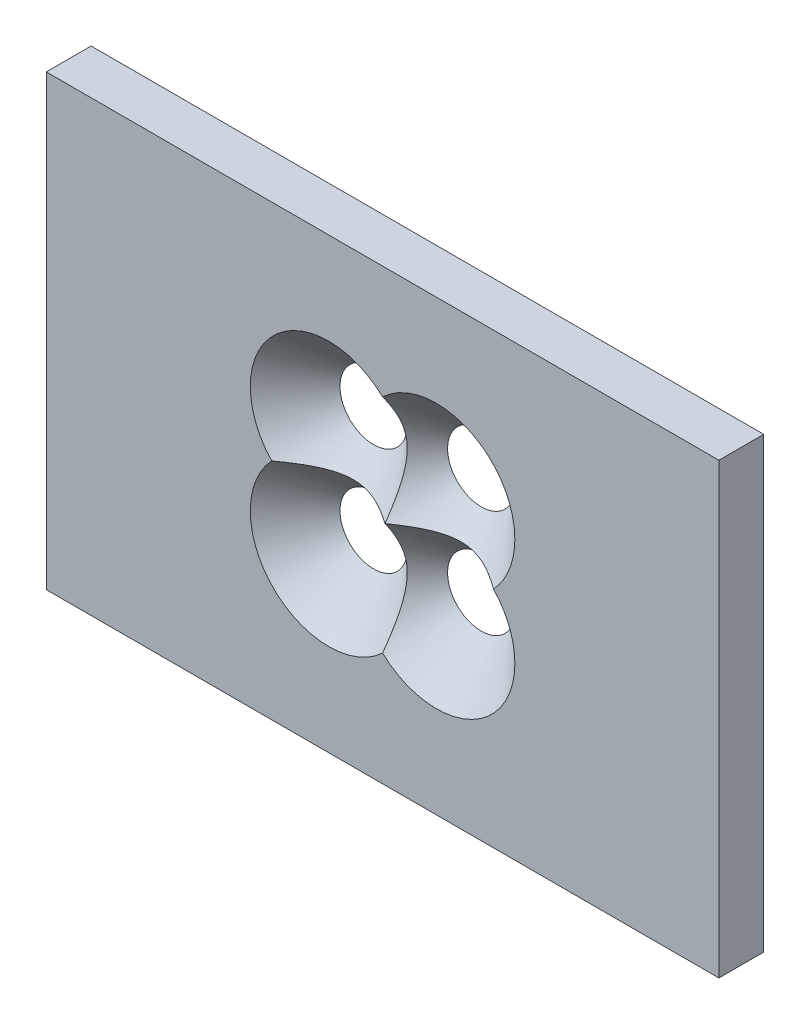
ISO-10303-21;
HEADER;
FILE_DESCRIPTION(('STEP AP214'),'2;1');
FILE_NAME('part.step','',(''),(''),'','','');
FILE_SCHEMA(('AUTOMOTIVE_DESIGN { 1 0 10303 214 1 1 1 1 }'));
ENDSEC;
DATA;
#1=APPLICATION_CONTEXT('core data for automotive mechanical design processes');
#2=APPLICATION_PROTOCOL_DEFINITION('international standard','automotive_design',2000,#1);
#3=PRODUCT_CONTEXT('',#1,'mechanical');
#4=PRODUCT('Part','Part','',(#3));
#5=PRODUCT_RELATED_PRODUCT_CATEGORY('part','',(#4));
#6=PRODUCT_DEFINITION_FORMATION('','',#4);
#7=PRODUCT_DEFINITION_CONTEXT('part definition',#1,'design');
#8=PRODUCT_DEFINITION('design','',#6,#7);
#9=PRODUCT_DEFINITION_SHAPE('','',#8);
#10=(LENGTH_UNIT() NAMED_UNIT(*) SI_UNIT(.MILLI.,.METRE.));
#11=(NAMED_UNIT(*) PLANE_ANGLE_UNIT() SI_UNIT($,.RADIAN.));
#12=(NAMED_UNIT(*) SI_UNIT($,.STERADIAN.) SOLID_ANGLE_UNIT());
#13=UNCERTAINTY_MEASURE_WITH_UNIT(LENGTH_MEASURE(1.E-05),#10,'distance_accuracy_value','');
#14=(GEOMETRIC_REPRESENTATION_CONTEXT(3) GLOBAL_UNCERTAINTY_ASSIGNED_CONTEXT((#13)) GLOBAL_UNIT_ASSIGNED_CONTEXT((#10,
#11,#12)) REPRESENTATION_CONTEXT('',''));
#15=CARTESIAN_POINT('',(0.,0.,0.));
#16=DIRECTION('',(0.,0.,1.));
#17=DIRECTION('',(1.,0.,0.));
#18=AXIS2_PLACEMENT_3D('',#15,#16,#17);
#19=CARTESIAN_POINT('',(0.,0.,100.));
#20=DIRECTION('',(0.,0.,-1.));
#21=DIRECTION('',(-1.,0.,0.));
#22=AXIS2_PLACEMENT_3D('',#19,#20,#21);
#23=PLANE('',#22);
#24=CARTESIAN_POINT('',(120.,-120.,100.));
#25=DIRECTION('',(0.,0.,-1.));
#26=DIRECTION('',(-1.,0.,0.));
#27=AXIS2_PLACEMENT_3D('',#24,#25,#26);
#28=CIRCLE('',#27,175.000000000001);
#29=CARTESIAN_POINT('',(247.377392028571,0.,100.));
#30=VERTEX_POINT('',#29);
#31=CARTESIAN_POINT('',(2.63677968348475E-13,-247.377392028571,100.));
#32=VERTEX_POINT('',#31);
#33=EDGE_CURVE('E47',#30,#32,#28,.T.);
#34=ORIENTED_EDGE('',*,*,#33,.T.);
#35=CARTESIAN_POINT('',(-120.,-120.,100.));
#36=DIRECTION('',(0.,0.,-1.));
#37=DIRECTION('',(-1.,0.,0.));
#38=AXIS2_PLACEMENT_3D('',#35,#36,#37);
#39=CIRCLE('',#38,175.000000000001);
#40=CARTESIAN_POINT('',(-247.37739202857,0.,100.));
#41=VERTEX_POINT('',#40);
#42=EDGE_CURVE('E11',#32,#41,#39,.T.);
#43=ORIENTED_EDGE('',*,*,#42,.T.);
#44=CARTESIAN_POINT('',(-120.,120.,100.));
#45=DIRECTION('',(0.,0.,-1.));
#46=DIRECTION('',(-1.,0.,0.));
#47=AXIS2_PLACEMENT_3D('',#44,#45,#46);
#48=CIRCLE('',#47,175.000000000001);
#49=CARTESIAN_POINT('',(2.35922392732846E-13,247.377392028571,100.));
#50=VERTEX_POINT('',#49);
#51=EDGE_CURVE('E113',#41,#50,#48,.T.);
#52=ORIENTED_EDGE('',*,*,#51,.T.);
#53=CARTESIAN_POINT('',(120.,120.,100.));
#54=DIRECTION('',(0.,0.,-1.));
#55=DIRECTION('',(-1.,0.,0.));
#56=AXIS2_PLACEMENT_3D('',#53,#54,#55);
#57=CIRCLE('',#56,175.000000000001);
#58=EDGE_CURVE('E115',#50,#30,#57,.T.);
#59=ORIENTED_EDGE('',*,*,#58,.T.);
#60=EDGE_LOOP('',(#34,#43,#52,#59));
#61=FACE_BOUND('',#60,.T.);
#62=DIRECTION('',(0.,1.,0.));
#63=VECTOR('',#62,1.);
#64=CARTESIAN_POINT('',(750.,-500.,100.));
#65=LINE('',#64,#63);
#66=CARTESIAN_POINT('',(750.,-500.,100.));
#67=VERTEX_POINT('',#66);
#68=CARTESIAN_POINT('',(750.,500.,100.));
#69=VERTEX_POINT('',#68);
#70=EDGE_CURVE('E100',#67,#69,#65,.T.);
#71=ORIENTED_EDGE('',*,*,#70,.T.);
#72=DIRECTION('',(-1.,0.,0.));
#73=VECTOR('',#72,1.);
#74=CARTESIAN_POINT('',(-750.,500.,100.));
#75=LINE('',#74,#73);
#76=CARTESIAN_POINT('',(-750.,500.,100.));
#77=VERTEX_POINT('',#76);
#78=EDGE_CURVE('E89',#69,#77,#75,.T.);
#79=ORIENTED_EDGE('',*,*,#78,.T.);
#80=DIRECTION('',(0.,-1.,0.));
#81=VECTOR('',#80,1.);
#82=CARTESIAN_POINT('',(-750.,-500.,100.));
#83=LINE('',#82,#81);
#84=CARTESIAN_POINT('',(-750.,-500.,100.));
#85=VERTEX_POINT('',#84);
#86=EDGE_CURVE('E99',#77,#85,#83,.T.);
#87=ORIENTED_EDGE('',*,*,#86,.T.);
#88=DIRECTION('',(1.,0.,0.));
#89=VECTOR('',#88,1.);
#90=CARTESIAN_POINT('',(-750.,-500.,100.));
#91=LINE('',#90,#89);
#92=EDGE_CURVE('E104',#85,#67,#91,.T.);
#93=ORIENTED_EDGE('',*,*,#92,.T.);
#94=EDGE_LOOP('',(#71,#79,#87,#93));
#95=FACE_BOUND('',#94,.T.);
#96=ADVANCED_FACE('F33',(#61,#95),#23,.F.);
#97=CARTESIAN_POINT('',(0.,0.,0.));
#98=DIRECTION('',(0.,0.,-1.));
#99=DIRECTION('',(-1.,0.,0.));
#100=AXIS2_PLACEMENT_3D('',#97,#98,#99);
#101=PLANE('',#100);
#102=CARTESIAN_POINT('',(120.,-120.,0.));
#103=DIRECTION('',(0.,0.,1.));
#104=DIRECTION('',(1.,0.,0.));
#105=AXIS2_PLACEMENT_3D('',#102,#103,#104);
#106=CIRCLE('',#105,75.);
#107=CARTESIAN_POINT('',(195.,-120.,0.));
#108=VERTEX_POINT('',#107);
#109=EDGE_CURVE('E260',#108,#108,#106,.T.);
#110=ORIENTED_EDGE('',*,*,#109,.T.);
#111=EDGE_LOOP('',(#110));
#112=FACE_BOUND('',#111,.T.);
#113=CARTESIAN_POINT('',(-120.,120.,0.));
#114=DIRECTION('',(0.,0.,1.));
#115=DIRECTION('',(1.,0.,0.));
#116=AXIS2_PLACEMENT_3D('',#113,#114,#115);
#117=CIRCLE('',#116,75.);
#118=CARTESIAN_POINT('',(-44.9999999999996,120.,0.));
#119=VERTEX_POINT('',#118);
#120=EDGE_CURVE('E259',#119,#119,#117,.T.);
#121=ORIENTED_EDGE('',*,*,#120,.T.);
#122=EDGE_LOOP('',(#121));
#123=FACE_BOUND('',#122,.T.);
#124=DIRECTION('',(0.,1.,0.));
#125=VECTOR('',#124,1.);
#126=CARTESIAN_POINT('',(750.,-500.,0.));
#127=LINE('',#126,#125);
#128=CARTESIAN_POINT('',(750.,-500.,0.));
#129=VERTEX_POINT('',#128);
#130=CARTESIAN_POINT('',(750.,500.,0.));
#131=VERTEX_POINT('',#130);
#132=EDGE_CURVE('E112',#129,#131,#127,.T.);
#133=ORIENTED_EDGE('',*,*,#132,.F.);
#134=DIRECTION('',(1.,0.,0.));
#135=VECTOR('',#134,1.);
#136=CARTESIAN_POINT('',(-750.,-500.,0.));
#137=LINE('',#136,#135);
#138=CARTESIAN_POINT('',(-750.,-500.,0.));
#139=VERTEX_POINT('',#138);
#140=EDGE_CURVE('E108',#139,#129,#137,.T.);
#141=ORIENTED_EDGE('',*,*,#140,.F.);
#142=DIRECTION('',(0.,-1.,0.));
#143=VECTOR('',#142,1.);
#144=CARTESIAN_POINT('',(-750.,-500.,0.));
#145=LINE('',#144,#143);
#146=CARTESIAN_POINT('',(-750.,500.,0.));
#147=VERTEX_POINT('',#146);
#148=EDGE_CURVE('E274',#147,#139,#145,.T.);
#149=ORIENTED_EDGE('',*,*,#148,.F.);
#150=DIRECTION('',(-1.,0.,0.));
#151=VECTOR('',#150,1.);
#152=CARTESIAN_POINT('',(-750.,500.,0.));
#153=LINE('',#152,#151);
#154=EDGE_CURVE('E272',#131,#147,#153,.T.);
#155=ORIENTED_EDGE('',*,*,#154,.F.);
#156=EDGE_LOOP('',(#133,#141,#149,#155));
#157=FACE_BOUND('',#156,.T.);
#158=CARTESIAN_POINT('',(120.,120.,0.));
#159=DIRECTION('',(0.,0.,1.));
#160=DIRECTION('',(1.,0.,0.));
#161=AXIS2_PLACEMENT_3D('',#158,#159,#160);
#162=CIRCLE('',#161,75.);
#163=CARTESIAN_POINT('',(195.,120.,0.));
#164=VERTEX_POINT('',#163);
#165=EDGE_CURVE('E257',#164,#164,#162,.T.);
#166=ORIENTED_EDGE('',*,*,#165,.T.);
#167=EDGE_LOOP('',(#166));
#168=FACE_BOUND('',#167,.T.);
#169=CARTESIAN_POINT('',(-120.,-120.,0.));
#170=DIRECTION('',(0.,0.,1.));
#171=DIRECTION('',(1.,0.,0.));
#172=AXIS2_PLACEMENT_3D('',#169,#170,#171);
#173=CIRCLE('',#172,75.);
#174=CARTESIAN_POINT('',(-44.9999999999996,-120.,0.));
#175=VERTEX_POINT('',#174);
#176=EDGE_CURVE('E168',#175,#175,#173,.T.);
#177=ORIENTED_EDGE('',*,*,#176,.T.);
#178=EDGE_LOOP('',(#177));
#179=FACE_BOUND('',#178,.T.);
#180=ADVANCED_FACE('F176',(#112,#123,#157,#168,#179),#101,.T.);
#181=CARTESIAN_POINT('',(750.,-500.,100.));
#182=DIRECTION('',(-1.,0.,0.));
#183=DIRECTION('',(0.,0.,1.));
#184=AXIS2_PLACEMENT_3D('',#181,#182,#183);
#185=PLANE('',#184);
#186=ORIENTED_EDGE('',*,*,#132,.T.);
#187=DIRECTION('',(0.,0.,-1.));
#188=VECTOR('',#187,1.);
#189=CARTESIAN_POINT('',(750.,500.,100.));
#190=LINE('',#189,#188);
#191=EDGE_CURVE('E93',#69,#131,#190,.T.);
#192=ORIENTED_EDGE('',*,*,#191,.F.);
#193=ORIENTED_EDGE('',*,*,#70,.F.);
#194=DIRECTION('',(0.,0.,-1.));
#195=VECTOR('',#194,1.);
#196=CARTESIAN_POINT('',(750.,-500.,100.));
#197=LINE('',#196,#195);
#198=EDGE_CURVE('E270',#67,#129,#197,.T.);
#199=ORIENTED_EDGE('',*,*,#198,.T.);
#200=EDGE_LOOP('',(#186,#192,#193,#199));
#201=FACE_BOUND('',#200,.T.);
#202=ADVANCED_FACE('F110',(#201),#185,.F.);
#203=CARTESIAN_POINT('',(-750.,500.,100.));
#204=DIRECTION('',(0.,-1.,0.));
#205=DIRECTION('',(0.,0.,-1.));
#206=AXIS2_PLACEMENT_3D('',#203,#204,#205);
#207=PLANE('',#206);
#208=ORIENTED_EDGE('',*,*,#154,.T.);
#209=DIRECTION('',(0.,0.,-1.));
#210=VECTOR('',#209,1.);
#211=CARTESIAN_POINT('',(-750.,500.,100.));
#212=LINE('',#211,#210);
#213=EDGE_CURVE('E96',#77,#147,#212,.T.);
#214=ORIENTED_EDGE('',*,*,#213,.F.);
#215=ORIENTED_EDGE('',*,*,#78,.F.);
#216=ORIENTED_EDGE('',*,*,#191,.T.);
#217=EDGE_LOOP('',(#208,#214,#215,#216));
#218=FACE_BOUND('',#217,.T.);
#219=ADVANCED_FACE('F91',(#218),#207,.F.);
#220=CARTESIAN_POINT('',(-750.,-500.,100.));
#221=DIRECTION('',(1.,0.,0.));
#222=DIRECTION('',(0.,0.,-1.));
#223=AXIS2_PLACEMENT_3D('',#220,#221,#222);
#224=PLANE('',#223);
#225=ORIENTED_EDGE('',*,*,#148,.T.);
#226=DIRECTION('',(0.,0.,-1.));
#227=VECTOR('',#226,1.);
#228=CARTESIAN_POINT('',(-750.,-500.,100.));
#229=LINE('',#228,#227);
#230=EDGE_CURVE('E117',#85,#139,#229,.T.);
#231=ORIENTED_EDGE('',*,*,#230,.F.);
#232=ORIENTED_EDGE('',*,*,#86,.F.);
#233=ORIENTED_EDGE('',*,*,#213,.T.);
#234=EDGE_LOOP('',(#225,#231,#232,#233));
#235=FACE_BOUND('',#234,.T.);
#236=ADVANCED_FACE('F187',(#235),#224,.F.);
#237=CARTESIAN_POINT('',(-750.,-500.,100.));
#238=DIRECTION('',(0.,1.,0.));
#239=DIRECTION('',(0.,0.,1.));
#240=AXIS2_PLACEMENT_3D('',#237,#238,#239);
#241=PLANE('',#240);
#242=ORIENTED_EDGE('',*,*,#140,.T.);
#243=ORIENTED_EDGE('',*,*,#198,.F.);
#244=ORIENTED_EDGE('',*,*,#92,.F.);
#245=ORIENTED_EDGE('',*,*,#230,.T.);
#246=EDGE_LOOP('',(#242,#243,#244,#245));
#247=FACE_BOUND('',#246,.T.);
#248=ADVANCED_FACE('F184',(#247),#241,.F.);
#249=CARTESIAN_POINT('',(120.,120.,-1.74860126378462E-12));
#250=DIRECTION('',(0.,0.,1.));
#251=DIRECTION('',(1.,0.,0.));
#252=AXIS2_PLACEMENT_3D('',#249,#250,#251);
#253=CONICAL_SURFACE('',#252,75.,0.785398163397443);
#254=ORIENTED_EDGE('',*,*,#165,.F.);
#255=EDGE_LOOP('',(#254));
#256=FACE_BOUND('',#255,.T.);
#257=CARTESIAN_POINT('',(247.377666802467,0.,100.0002));
#258=CARTESIAN_POINT('',(245.678079233707,0.,98.7631591177888));
#259=CARTESIAN_POINT('',(243.972975012222,0.,97.533665722493));
#260=CARTESIAN_POINT('',(240.550818607246,0.,95.0913270112612));
#261=CARTESIAN_POINT('',(238.833766100815,0.,93.8784821479578));
#262=CARTESIAN_POINT('',(235.386258471237,0.,91.4706194029449));
#263=CARTESIAN_POINT('',(233.655798663167,0.,90.2756082231325));
#264=CARTESIAN_POINT('',(230.181155356152,0.,87.9057166334808));
#265=CARTESIAN_POINT('',(228.436971942127,0.,86.7308360992191));
#266=CARTESIAN_POINT('',(224.914311341916,0.,84.3902779141285));
#267=CARTESIAN_POINT('',(223.135668647346,0.,83.2248491386579));
#268=CARTESIAN_POINT('',(219.562186512449,0.,80.9190995319762));
#269=CARTESIAN_POINT('',(217.7673471943,0.,79.7787785115887));
#270=CARTESIAN_POINT('',(214.160417112664,0.,77.5260647822753));
#271=CARTESIAN_POINT('',(212.348327811377,0.,76.4136697347602));
#272=CARTESIAN_POINT('',(208.705497504982,0.,74.2198075456046));
#273=CARTESIAN_POINT('',(206.874756466073,0.,73.1383404600245));
#274=CARTESIAN_POINT('',(203.113599518357,0.,70.9637454223439));
#275=CARTESIAN_POINT('',(201.182300987805,0.,69.8721413869572));
#276=CARTESIAN_POINT('',(197.296506765329,0.,67.7309401452992));
#277=CARTESIAN_POINT('',(195.342010976038,0.,66.681343115428));
#278=CARTESIAN_POINT('',(191.407929718509,0.,64.629063895269));
#279=CARTESIAN_POINT('',(189.428338674419,0.,63.6263923719415));
#280=CARTESIAN_POINT('',(185.443162712769,0.,61.6740287799874));
#281=CARTESIAN_POINT('',(183.437578021668,0.,60.7243362501847));
#282=CARTESIAN_POINT('',(179.408058443373,0.,58.8884422595546));
#283=CARTESIAN_POINT('',(177.384241923012,0.,58.0019816696906));
#284=CARTESIAN_POINT('',(173.308789835771,0.,56.2950998124127));
#285=CARTESIAN_POINT('',(171.257153387731,0.,55.4746806425126));
#286=CARTESIAN_POINT('',(167.126813228033,0.,53.9080575761844));
#287=CARTESIAN_POINT('',(165.048123480417,0.,53.1618169852112));
#288=CARTESIAN_POINT('',(160.863244495565,0.,51.7514293306531));
#289=CARTESIAN_POINT('',(158.75705867187,0.,51.0872721818586));
#290=CARTESIAN_POINT('',(154.647316158132,0.,49.8872025009053));
#291=CARTESIAN_POINT('',(152.645325411221,0.,49.345941685801));
#292=CARTESIAN_POINT('',(148.619875466235,0.,48.3502933248938));
#293=CARTESIAN_POINT('',(146.596417446731,0.,47.8959010357184));
#294=CARTESIAN_POINT('',(142.530285060669,0.,47.0804914989858));
#295=CARTESIAN_POINT('',(140.487607065834,0.,46.7194922638175));
#296=CARTESIAN_POINT('',(136.387086136158,0.,46.0967818998838));
#297=CARTESIAN_POINT('',(134.329243140303,0.,45.8350711708033));
#298=CARTESIAN_POINT('',(130.236774535903,0.,45.4189196455923));
#299=CARTESIAN_POINT('',(128.202321247488,0.,45.2627908866856));
#300=CARTESIAN_POINT('',(124.128107502655,0.,45.0537492705719));
#301=CARTESIAN_POINT('',(122.088347096232,0.,45.0008354445566));
#302=CARTESIAN_POINT('',(118.008837589929,0.,44.9991842322347));
#303=CARTESIAN_POINT('',(115.969088491121,0.,45.0504441533571));
#304=CARTESIAN_POINT('',(111.894822647311,0.,45.256202972461));
#305=CARTESIAN_POINT('',(109.86030592187,0.,45.4107022558428));
#306=CARTESIAN_POINT('',(105.809341635487,0.,45.819407788567));
#307=CARTESIAN_POINT('',(103.792854592753,0.,46.0732247665416));
#308=CARTESIAN_POINT('',(99.7742742232323,0.,46.6763459904533));
#309=CARTESIAN_POINT('',(97.7721809295636,0.,47.0256504560133));
#310=CARTESIAN_POINT('',(93.7856831121091,0.,47.8143800450102));
#311=CARTESIAN_POINT('',(91.8012804942418,0.,48.2538147591353));
#312=CARTESIAN_POINT('',(87.8530069396337,0.,49.2165976644573));
#313=CARTESIAN_POINT('',(85.889136157865,0.,49.7399464885421));
#314=CARTESIAN_POINT('',(81.9529462879107,0.,50.8728308866616));
#315=CARTESIAN_POINT('',(79.9809820074608,0.,51.4835949993606));
#316=CARTESIAN_POINT('',(76.061078540923,0.,52.7779545847461));
#317=CARTESIAN_POINT('',(74.1131405596655,0.,53.4615536934051));
#318=CARTESIAN_POINT('',(70.2419870735508,0.,54.8946763651614));
#319=CARTESIAN_POINT('',(68.3187689002611,0.,55.6441927430022));
#320=CARTESIAN_POINT('',(64.4966319955872,0.,57.202793705585));
#321=CARTESIAN_POINT('',(62.5977137812669,0.,58.0118795554035));
#322=CARTESIAN_POINT('',(59.1617703784402,0.,59.5338691164614));
#323=CARTESIAN_POINT('',(57.6208591303576,0.,60.2380353633006));
#324=CARTESIAN_POINT('',(54.5545621844083,0.,61.6794574834304));
#325=CARTESIAN_POINT('',(53.0291768319537,0.,62.4167140909331));
#326=CARTESIAN_POINT('',(49.9932868822399,0.,63.921566729431));
#327=CARTESIAN_POINT('',(48.4827837209339,0.,64.6891656529666));
#328=CARTESIAN_POINT('',(45.4761601434631,0.,66.2520916895603));
#329=CARTESIAN_POINT('',(43.980040085779,0.,67.0474194914515));
#330=CARTESIAN_POINT('',(41.0000405441808,0.,68.6642803036741));
#331=CARTESIAN_POINT('',(39.5161753095,0.,69.4858395484799));
#332=CARTESIAN_POINT('',(36.5615660698456,0.,71.1522633755801));
#333=CARTESIAN_POINT('',(35.090822309916,0.,71.9971283919102));
#334=CARTESIAN_POINT('',(32.1619282482796,0.,73.7081508806937));
#335=CARTESIAN_POINT('',(30.703777020075,0.,74.5743067683179));
#336=CARTESIAN_POINT('',(27.7992963773939,0.,76.3262322245131));
#337=CARTESIAN_POINT('',(26.3529671133734,0.,77.2120020421766));
#338=CARTESIAN_POINT('',(22.1456641827337,0.,79.8249515752675));
#339=CARTESIAN_POINT('',(19.3996963676134,0.,81.5763338911389));
#340=CARTESIAN_POINT('',(13.9446946012817,0.,85.135744728808));
#341=CARTESIAN_POINT('',(11.2356619496815,0.,86.9437752365008));
#342=CARTESIAN_POINT('',(7.20106504041256,0.,89.6895084408082));
#343=CARTESIAN_POINT('',(5.86302797406436,0.,90.6089505825074));
#344=CARTESIAN_POINT('',(3.19474193335325,0.,92.4590809668022));
#345=CARTESIAN_POINT('',(1.86449298059174,0.,93.3897692405686));
#346=CARTESIAN_POINT('',(-0.788454066796034,0.,95.2614660728441));
#347=CARTESIAN_POINT('',(-2.11115314221584,0.,96.2024732422041));
#348=CARTESIAN_POINT('',(-4.74955524042687,0.,98.0942147220368));
#349=CARTESIAN_POINT('',(-6.06525834317395,0.,99.044948920976));
#350=CARTESIAN_POINT('',(-7.37766680246643,0.,100.0002));
#351=B_SPLINE_CURVE_WITH_KNOTS('',3,(#257,#258,#259,#260,#261,#262,#263,#264,#265,#266,#267,
#268,#269,#270,#271,#272,#273,#274,#275,#276,#277,#278,#279,#280,#281,#282,#283,#284,#285,#286,
#287,#288,#289,#290,#291,#292,#293,#294,#295,#296,#297,#298,#299,#300,#301,#302,#303,#304,#305,
#306,#307,#308,#309,#310,#311,#312,#313,#314,#315,#316,#317,#318,#319,#320,#321,#322,#323,#324,
#325,#326,#327,#328,#329,#330,#331,#332,#333,#334,#335,#336,#337,#338,#339,#340,#341,#342,#343,
#344,#345,#346,#347,#348,#349,#350),.UNSPECIFIED.,.F.,.F.,(4,2,2,2,2,2,2,2,2,2,2,2,2,2,2,2,2,2,
2,2,2,2,2,2,2,2,2,2,2,2,2,2,2,2,2,2,2,2,2,2,2,2,2,2,2,2,4),(0.,6.30633816103411,
12.6128474376992,18.9216698682924,25.230453291599,31.6096151272588,37.9887288821992,
44.367306640444,50.7458959598095,57.4007715624049,64.0556751079186,70.7120841498134,
77.3684352394091,83.9957210792219,90.6232173225094,97.2474185981264,103.870805178199,
110.09062901598,116.310113129193,122.530795879632,128.751503671104,134.870246972121,
140.988932840385,147.107460561445,153.226011123556,159.320816710294,165.415636315308,
171.511104802015,177.60661926346,183.798218591365,189.990127153068,196.181361605562,
202.372727579203,207.454874903869,212.53713504749,217.619880858196,222.702753023163,
227.790878522526,232.879098844789,237.966941555168,243.054848917104,252.824785477402,
262.595064922856,267.465484880326,272.335918340188,277.205703991681,282.075433867026),.UNSPECIFIED.);
#352=CARTESIAN_POINT('',(1.82668317608996E-13,0.,94.7056274847708));
#353=VERTEX_POINT('',#352);
#354=EDGE_CURVE('E158',#30,#353,#351,.T.);
#355=ORIENTED_EDGE('',*,*,#354,.F.);
#356=ORIENTED_EDGE('',*,*,#58,.F.);
#357=CARTESIAN_POINT('',(2.52550743007721E-13,247.377666802467,100.0002));
#358=CARTESIAN_POINT('',(2.25763773224837E-13,245.678079233706,98.7631591177888));
#359=CARTESIAN_POINT('',(2.17597576978972E-13,243.972975012222,97.5336657224931));
#360=CARTESIAN_POINT('',(2.08151446415143E-13,240.550818607246,95.0913270112612));
#361=CARTESIAN_POINT('',(2.06871698954423E-13,238.833766100815,93.8784821479579));
#362=CARTESIAN_POINT('',(1.80836565990806E-13,235.386258471236,91.470619402945));
#363=CARTESIAN_POINT('',(1.56072570070295E-13,233.655798663167,90.2756082231326));
#364=CARTESIAN_POINT('',(1.34953255413175E-13,230.181155356152,87.9057166334809));
#365=CARTESIAN_POINT('',(1.38597761027395E-13,228.436971942126,86.7308360992192));
#366=CARTESIAN_POINT('',(1.16484774452572E-13,224.914311341916,84.3902779141286));
#367=CARTESIAN_POINT('',(0.,223.135668647345,83.2248491386581));
#368=CARTESIAN_POINT('',(0.,219.562186512448,80.9190995319763));
#369=CARTESIAN_POINT('',(0.,217.7673471943,79.778778511589));
#370=CARTESIAN_POINT('',(0.,214.160417112663,77.5260647822756));
#371=CARTESIAN_POINT('',(0.,212.348327811377,76.4136697347604));
#372=CARTESIAN_POINT('',(0.,208.705497504982,74.2198075456048));
#373=CARTESIAN_POINT('',(0.,206.874756466073,73.1383404600247));
#374=CARTESIAN_POINT('',(0.,203.113599518357,70.9637454223442));
#375=CARTESIAN_POINT('',(0.,201.182300987804,69.8721413869575));
#376=CARTESIAN_POINT('',(0.,197.296506765328,67.7309401452995));
#377=CARTESIAN_POINT('',(0.,195.342010976037,66.6813431154283));
#378=CARTESIAN_POINT('',(0.,191.407929718509,64.6290638952694));
#379=CARTESIAN_POINT('',(0.,189.428338674419,63.6263923719419));
#380=CARTESIAN_POINT('',(0.,185.443162712769,61.6740287799877));
#381=CARTESIAN_POINT('',(0.,183.437578021668,60.7243362501851));
#382=CARTESIAN_POINT('',(0.,179.408058443373,58.888442259555));
#383=CARTESIAN_POINT('',(0.,177.384241923012,58.001981669691));
#384=CARTESIAN_POINT('',(0.,173.308789835771,56.2950998124131));
#385=CARTESIAN_POINT('',(0.,171.257153387731,55.4746806425131));
#386=CARTESIAN_POINT('',(0.,167.126813228032,53.9080575761849));
#387=CARTESIAN_POINT('',(0.,165.048123480417,53.1618169852116));
#388=CARTESIAN_POINT('',(0.,160.863244495564,51.7514293306536));
#389=CARTESIAN_POINT('',(0.,158.75705867187,51.0872721818591));
#390=CARTESIAN_POINT('',(0.,154.647316158132,49.8872025009058));
#391=CARTESIAN_POINT('',(0.,152.645325411221,49.3459416858015));
#392=CARTESIAN_POINT('',(0.,148.619875466234,48.3502933248943));
#393=CARTESIAN_POINT('',(0.,146.596417446731,47.8959010357189));
#394=CARTESIAN_POINT('',(-1.03078262430925E-13,142.530285060669,47.0804914989863));
#395=CARTESIAN_POINT('',(-1.0288552288412E-13,140.487607065834,46.719492263818));
#396=CARTESIAN_POINT('',(-1.04514814098158E-13,136.387086136157,46.0967818998843));
#397=CARTESIAN_POINT('',(-1.06336852969356E-13,134.329243140302,45.8350711708038));
#398=CARTESIAN_POINT('',(-1.08756022793169E-13,130.236774535903,45.4189196455928));
#399=CARTESIAN_POINT('',(-1.09372741856398E-13,128.202321247487,45.2627908866861));
#400=CARTESIAN_POINT('',(-1.1021492272288E-13,124.128107502654,45.0537492705724));
#401=CARTESIAN_POINT('',(-1.10440388198562E-13,122.088347096231,45.0008354445571));
#402=CARTESIAN_POINT('',(-1.09662994951792E-13,118.008837589929,44.9991842322352));
#403=CARTESIAN_POINT('',(-1.0866016797719E-13,115.96908849112,45.0504441533576));
#404=CARTESIAN_POINT('',(-1.07977656510849E-13,111.89482264731,45.2562029724615));
#405=CARTESIAN_POINT('',(-1.08297976958542E-13,109.86030592187,45.4107022558433));
#406=CARTESIAN_POINT('',(-1.0474085228833E-13,105.809341635487,45.8194077885675));
#407=CARTESIAN_POINT('',(-1.00879693106361E-13,103.792854592752,46.0732247665421));
#408=CARTESIAN_POINT('',(-1.00975194012543E-13,99.7742742232316,46.6763459904539));
#409=CARTESIAN_POINT('',(-1.04931872081984E-13,97.7721809295629,47.0256504560138));
#410=CARTESIAN_POINT('',(-1.01139144490519E-13,93.7856831121084,47.8143800450107));
#411=CARTESIAN_POINT('',(0.,91.8012804942411,48.2538147591358));
#412=CARTESIAN_POINT('',(0.,87.853006939633,49.2165976644579));
#413=CARTESIAN_POINT('',(0.,85.8891361578642,49.7399464885427));
#414=CARTESIAN_POINT('',(0.,81.9529462879099,50.8728308866622));
#415=CARTESIAN_POINT('',(0.,79.98098200746,51.4835949993612));
#416=CARTESIAN_POINT('',(0.,76.0610785409222,52.7779545847467));
#417=CARTESIAN_POINT('',(0.,74.1131405596647,53.4615536934057));
#418=CARTESIAN_POINT('',(0.,70.2419870735499,54.894676365162));
#419=CARTESIAN_POINT('',(0.,68.3187689002602,55.6441927430028));
#420=CARTESIAN_POINT('',(0.,64.4966319955863,57.2027937055856));
#421=CARTESIAN_POINT('',(0.,62.597713781266,58.0118795554041));
#422=CARTESIAN_POINT('',(0.,59.1617703784393,59.5338691164621));
#423=CARTESIAN_POINT('',(0.,57.6208591303568,60.2380353633012));
#424=CARTESIAN_POINT('',(0.,54.5545621844075,61.679457483431));
#425=CARTESIAN_POINT('',(0.,53.0291768319529,62.4167140909337));
#426=CARTESIAN_POINT('',(0.,49.9932868822391,63.9215667294316));
#427=CARTESIAN_POINT('',(0.,48.4827837209331,64.6891656529672));
#428=CARTESIAN_POINT('',(0.,45.4761601434624,66.2520916895608));
#429=CARTESIAN_POINT('',(0.,43.9800400857783,67.047419491452));
#430=CARTESIAN_POINT('',(0.,41.0000405441801,68.6642803036746));
#431=CARTESIAN_POINT('',(0.,39.5161753094994,69.4858395484804));
#432=CARTESIAN_POINT('',(0.,36.561566069845,71.1522633755806));
#433=CARTESIAN_POINT('',(0.,35.0908223099155,71.9971283919106));
#434=CARTESIAN_POINT('',(0.,32.161928248279,73.7081508806941));
#435=CARTESIAN_POINT('',(0.,30.7037770200745,74.5743067683183));
#436=CARTESIAN_POINT('',(0.,27.7992963773934,76.3262322245134));
#437=CARTESIAN_POINT('',(0.,26.3529671133729,77.212002042177));
#438=CARTESIAN_POINT('',(0.,22.1456641827333,79.8249515752678));
#439=CARTESIAN_POINT('',(0.,19.399696367613,81.5763338911392));
#440=CARTESIAN_POINT('',(1.25065961088216E-13,13.9446946012814,85.1357447288082));
#441=CARTESIAN_POINT('',(1.52051850966307E-13,11.2356619496811,86.9437752365009));
#442=CARTESIAN_POINT('',(1.58664134930446E-13,7.20106504041224,89.6895084408083));
#443=CARTESIAN_POINT('',(1.55254437777806E-13,5.86302797406405,90.6089505825076));
#444=CARTESIAN_POINT('',(1.6382642076892E-13,3.19474193335295,92.4590809668024));
#445=CARTESIAN_POINT('',(1.75808143582619E-13,1.86449298059147,93.3897692405687));
#446=CARTESIAN_POINT('',(2.0126451105618E-13,-0.788454066796269,95.2614660728441));
#447=CARTESIAN_POINT('',(2.14738956932983E-13,-2.11115314221605,96.2024732422041));
#448=CARTESIAN_POINT('',(2.38490009867753E-13,-4.74955524042705,98.0942147220368));
#449=CARTESIAN_POINT('',(2.48766653550436E-13,-6.06525834317414,99.044948920976));
#450=CARTESIAN_POINT('',(2.55098602990039E-13,-7.37766680246662,100.0002));
#451=B_SPLINE_CURVE_WITH_KNOTS('',3,(#357,#358,#359,#360,#361,#362,#363,#364,#365,#366,#367,
#368,#369,#370,#371,#372,#373,#374,#375,#376,#377,#378,#379,#380,#381,#382,#383,#384,#385,#386,
#387,#388,#389,#390,#391,#392,#393,#394,#395,#396,#397,#398,#399,#400,#401,#402,#403,#404,#405,
#406,#407,#408,#409,#410,#411,#412,#413,#414,#415,#416,#417,#418,#419,#420,#421,#422,#423,#424,
#425,#426,#427,#428,#429,#430,#431,#432,#433,#434,#435,#436,#437,#438,#439,#440,#441,#442,#443,
#444,#445,#446,#447,#448,#449,#450),.UNSPECIFIED.,.F.,.F.,(4,2,2,2,2,2,2,2,2,2,2,2,2,2,2,2,2,2,
2,2,2,2,2,2,2,2,2,2,2,2,2,2,2,2,2,2,2,2,2,2,2,2,2,2,2,2,4),(0.,6.30633816103412,
12.6128474376992,18.9216698682923,25.2304532915989,31.6096151272587,37.9887288821991,
44.3673066404438,50.7458959598093,57.4007715624046,64.0556751079183,70.7120841498132,
77.3684352394088,83.9957210792215,90.6232173225091,97.247418598126,103.870805178198,
110.090629015979,116.310113129192,122.530795879632,128.751503671103,134.87024697212,
140.988932840385,147.107460561445,153.226011123556,159.320816710294,165.415636315308,
171.511104802015,177.60661926346,183.798218591365,189.990127153068,196.181361605562,
202.372727579203,207.454874903869,212.53713504749,217.619880858196,222.702753023163,
227.790878522526,232.879098844789,237.966941555168,243.054848917103,252.824785477402,
262.595064922856,267.465484880325,272.335918340187,277.20570399168,282.075433867025),.UNSPECIFIED.);
#452=EDGE_CURVE('E37',#353,#50,#451,.F.);
#453=ORIENTED_EDGE('',*,*,#452,.F.);
#454=EDGE_LOOP('',(#355,#356,#453));
#455=FACE_BOUND('',#454,.T.);
#456=ADVANCED_FACE('F151',(#256,#455),#253,.F.);
#457=CARTESIAN_POINT('',(-120.,120.,0.));
#458=DIRECTION('',(0.,0.,1.));
#459=DIRECTION('',(1.,0.,0.));
#460=AXIS2_PLACEMENT_3D('',#457,#458,#459);
#461=CONICAL_SURFACE('',#460,75.,0.78539816339745);
#462=ORIENTED_EDGE('',*,*,#120,.F.);
#463=EDGE_LOOP('',(#462));
#464=FACE_BOUND('',#463,.T.);
#465=ORIENTED_EDGE('',*,*,#452,.T.);
#466=ORIENTED_EDGE('',*,*,#51,.F.);
#467=CARTESIAN_POINT('',(7.37766680246693,0.,100.0002));
#468=CARTESIAN_POINT('',(5.67807923370678,0.,98.7631591177888));
#469=CARTESIAN_POINT('',(3.97297501222196,0.,97.5336657224931));
#470=CARTESIAN_POINT('',(0.550818607245968,0.,95.0913270112613));
#471=CARTESIAN_POINT('',(-1.1662338991848,0.,93.878482147958));
#472=CARTESIAN_POINT('',(-4.61374152876339,0.,91.4706194029451));
#473=CARTESIAN_POINT('',(-6.34420133683308,0.,90.2756082231327));
#474=CARTESIAN_POINT('',(-9.81884464384783,0.,87.905716633481));
#475=CARTESIAN_POINT('',(-11.5630280578735,0.,86.7308360992193));
#476=CARTESIAN_POINT('',(-15.085688658084,0.,84.3902779141287));
#477=CARTESIAN_POINT('',(-16.8643313526544,0.,83.2248491386582));
#478=CARTESIAN_POINT('',(-20.4378134875515,0.,80.9190995319765));
#479=CARTESIAN_POINT('',(-22.2326528057,0.,79.7787785115891));
#480=CARTESIAN_POINT('',(-25.8395828873365,0.,77.5260647822757));
#481=CARTESIAN_POINT('',(-27.651672188623,0.,76.4136697347605));
#482=CARTESIAN_POINT('',(-31.2945024950183,0.,74.219807545605));
#483=CARTESIAN_POINT('',(-33.1252435339273,0.,73.1383404600249));
#484=CARTESIAN_POINT('',(-36.886400481643,0.,70.9637454223444));
#485=CARTESIAN_POINT('',(-38.8176990121957,0.,69.8721413869577));
#486=CARTESIAN_POINT('',(-42.7034932346716,0.,67.7309401452997));
#487=CARTESIAN_POINT('',(-44.6579890239624,0.,66.6813431154285));
#488=CARTESIAN_POINT('',(-48.5920702814909,0.,64.6290638952696));
#489=CARTESIAN_POINT('',(-50.571661325581,0.,63.6263923719422));
#490=CARTESIAN_POINT('',(-54.5568372872311,0.,61.674028779988));
#491=CARTESIAN_POINT('',(-56.562421978332,0.,60.7243362501854));
#492=CARTESIAN_POINT('',(-60.5919415566268,0.,58.8884422595553));
#493=CARTESIAN_POINT('',(-62.6157580769881,0.,58.0019816696913));
#494=CARTESIAN_POINT('',(-66.6912101642288,0.,56.2950998124134));
#495=CARTESIAN_POINT('',(-68.7428466122691,0.,55.4746806425134));
#496=CARTESIAN_POINT('',(-72.8731867719676,0.,53.9080575761852));
#497=CARTESIAN_POINT('',(-74.9518765195831,0.,53.161816985212));
#498=CARTESIAN_POINT('',(-79.1367555044355,0.,51.751429330654));
#499=CARTESIAN_POINT('',(-81.2429413281302,0.,51.0872721818595));
#500=CARTESIAN_POINT('',(-85.3526838418678,0.,49.8872025009062));
#501=CARTESIAN_POINT('',(-87.3546745887791,0.,49.3459416858019));
#502=CARTESIAN_POINT('',(-91.3801245337655,0.,48.3502933248947));
#503=CARTESIAN_POINT('',(-93.4035825532688,0.,47.8959010357194));
#504=CARTESIAN_POINT('',(-97.4697149393314,0.,47.0804914989867));
#505=CARTESIAN_POINT('',(-99.512392934166,0.,46.7194922638185));
#506=CARTESIAN_POINT('',(-103.612913863843,0.,46.0967818998848));
#507=CARTESIAN_POINT('',(-105.670756859698,0.,45.8350711708042));
#508=CARTESIAN_POINT('',(-109.763225464097,0.,45.4189196455933));
#509=CARTESIAN_POINT('',(-111.797678752513,0.,45.2627908866866));
#510=CARTESIAN_POINT('',(-115.871892497346,0.,45.0537492705729));
#511=CARTESIAN_POINT('',(-117.911652903769,0.,45.0008354445577));
#512=CARTESIAN_POINT('',(-121.991162410071,0.,44.9991842322358));
#513=CARTESIAN_POINT('',(-124.03091150888,0.,45.0504441533581));
#514=CARTESIAN_POINT('',(-128.10517735269,0.,45.256202972462));
#515=CARTESIAN_POINT('',(-130.13969407813,0.,45.4107022558439));
#516=CARTESIAN_POINT('',(-134.190658364513,0.,45.8194077885681));
#517=CARTESIAN_POINT('',(-136.207145407248,0.,46.0732247665427));
#518=CARTESIAN_POINT('',(-140.225725776769,0.,46.6763459904545));
#519=CARTESIAN_POINT('',(-142.227819070437,0.,47.0256504560144));
#520=CARTESIAN_POINT('',(-146.214316887892,0.,47.8143800450114));
#521=CARTESIAN_POINT('',(-148.198719505759,0.,48.2538147591365));
#522=CARTESIAN_POINT('',(-152.146993060367,0.,49.2165976644586));
#523=CARTESIAN_POINT('',(-154.110863842136,0.,49.7399464885433));
#524=CARTESIAN_POINT('',(-158.04705371209,0.,50.8728308866629));
#525=CARTESIAN_POINT('',(-160.01901799254,0.,51.4835949993619));
#526=CARTESIAN_POINT('',(-163.938921459078,0.,52.7779545847474));
#527=CARTESIAN_POINT('',(-165.886859440336,0.,53.4615536934065));
#528=CARTESIAN_POINT('',(-169.75801292645,0.,54.8946763651628));
#529=CARTESIAN_POINT('',(-171.68123109974,0.,55.6441927430036));
#530=CARTESIAN_POINT('',(-175.503368004414,0.,57.2027937055864));
#531=CARTESIAN_POINT('',(-177.402286218734,0.,58.0118795554049));
#532=CARTESIAN_POINT('',(-180.838229621561,0.,59.5338691164628));
#533=CARTESIAN_POINT('',(-182.379140869644,0.,60.2380353633019));
#534=CARTESIAN_POINT('',(-185.445437815593,0.,61.6794574834317));
#535=CARTESIAN_POINT('',(-186.970823168047,0.,62.4167140909344));
#536=CARTESIAN_POINT('',(-190.006713117761,0.,63.9215667294323));
#537=CARTESIAN_POINT('',(-191.517216279067,0.,64.6891656529679));
#538=CARTESIAN_POINT('',(-194.523839856538,0.,66.2520916895615));
#539=CARTESIAN_POINT('',(-196.019959914222,0.,67.0474194914527));
#540=CARTESIAN_POINT('',(-198.99995945582,0.,68.6642803036752));
#541=CARTESIAN_POINT('',(-200.483824690501,0.,69.485839548481));
#542=CARTESIAN_POINT('',(-203.438433930155,0.,71.1522633755812));
#543=CARTESIAN_POINT('',(-204.909177690085,0.,71.9971283919112));
#544=CARTESIAN_POINT('',(-207.838071751721,0.,73.7081508806946));
#545=CARTESIAN_POINT('',(-209.296222979926,0.,74.5743067683188));
#546=CARTESIAN_POINT('',(-212.200703622607,0.,76.3262322245139));
#547=CARTESIAN_POINT('',(-213.647032886627,0.,77.2120020421774));
#548=CARTESIAN_POINT('',(-217.854335817267,0.,79.8249515752682));
#549=CARTESIAN_POINT('',(-220.600303632387,0.,81.5763338911395));
#550=CARTESIAN_POINT('',(-226.055305398718,0.,85.1357447288086));
#551=CARTESIAN_POINT('',(-228.764338050319,0.,86.9437752365012));
#552=CARTESIAN_POINT('',(-232.798934959587,0.,89.6895084408086));
#553=CARTESIAN_POINT('',(-234.136972025936,0.,90.6089505825078));
#554=CARTESIAN_POINT('',(-236.805258066647,0.,92.4590809668025));
#555=CARTESIAN_POINT('',(-238.135507019408,0.,93.3897692405688));
#556=CARTESIAN_POINT('',(-240.788454066796,0.,95.2614660728443));
#557=CARTESIAN_POINT('',(-242.111153142216,0.,96.2024732422043));
#558=CARTESIAN_POINT('',(-244.749555240427,0.,98.0942147220368));
#559=CARTESIAN_POINT('',(-246.065258343174,0.,99.044948920976));
#560=CARTESIAN_POINT('',(-247.377666802466,0.,100.0002));
#561=B_SPLINE_CURVE_WITH_KNOTS('',3,(#467,#468,#469,#470,#471,#472,#473,#474,#475,#476,#477,
#478,#479,#480,#481,#482,#483,#484,#485,#486,#487,#488,#489,#490,#491,#492,#493,#494,#495,#496,
#497,#498,#499,#500,#501,#502,#503,#504,#505,#506,#507,#508,#509,#510,#511,#512,#513,#514,#515,
#516,#517,#518,#519,#520,#521,#522,#523,#524,#525,#526,#527,#528,#529,#530,#531,#532,#533,#534,
#535,#536,#537,#538,#539,#540,#541,#542,#543,#544,#545,#546,#547,#548,#549,#550,#551,#552,#553,
#554,#555,#556,#557,#558,#559,#560),.UNSPECIFIED.,.F.,.F.,(4,2,2,2,2,2,2,2,2,2,2,2,2,2,2,2,2,2,
2,2,2,2,2,2,2,2,2,2,2,2,2,2,2,2,2,2,2,2,2,2,2,2,2,2,2,2,4),(0.,6.30633816103407,
12.6128474376992,18.9216698682923,25.2304532915989,31.6096151272587,37.9887288821991,
44.3673066404438,50.7458959598093,57.4007715624046,64.0556751079183,70.7120841498131,
77.3684352394088,83.9957210792215,90.6232173225091,97.247418598126,103.870805178199,
110.090629015979,116.310113129192,122.530795879632,128.751503671104,134.870246972121,
140.988932840385,147.107460561445,153.226011123556,159.320816710295,165.415636315308,
171.511104802015,177.60661926346,183.798218591366,189.990127153069,196.181361605562,
202.372727579204,207.45487490387,212.537135047491,217.619880858196,222.702753023163,
227.790878522526,232.879098844789,237.966941555168,243.054848917103,252.824785477401,
262.595064922855,267.465484880325,272.335918340187,277.20570399168,282.075433867025),.UNSPECIFIED.);
#562=EDGE_CURVE('E132',#353,#41,#561,.T.);
#563=ORIENTED_EDGE('',*,*,#562,.F.);
#564=EDGE_LOOP('',(#465,#466,#563));
#565=FACE_BOUND('',#564,.T.);
#566=ADVANCED_FACE('F145',(#464,#565),#461,.F.);
#567=CARTESIAN_POINT('',(120.,-120.,-1.74860126378462E-12));
#568=DIRECTION('',(0.,0.,1.));
#569=DIRECTION('',(1.,0.,0.));
#570=AXIS2_PLACEMENT_3D('',#567,#568,#569);
#571=CONICAL_SURFACE('',#570,75.,0.785398163397443);
#572=ORIENTED_EDGE('',*,*,#109,.F.);
#573=EDGE_LOOP('',(#572));
#574=FACE_BOUND('',#573,.T.);
#575=ORIENTED_EDGE('',*,*,#33,.F.);
#576=ORIENTED_EDGE('',*,*,#354,.T.);
#577=CARTESIAN_POINT('',(2.5167421281232E-13,-247.377666802467,100.0002));
#578=CARTESIAN_POINT('',(2.33735529184221E-13,-245.678079233706,98.7631591177888));
#579=CARTESIAN_POINT('',(2.22686882584786E-13,-243.972975012222,97.5336657224931));
#580=CARTESIAN_POINT('',(2.02317833315279E-13,-240.550818607246,95.0913270112613));
#581=CARTESIAN_POINT('',(1.92997477547363E-13,-238.833766100815,93.8784821479579));
#582=CARTESIAN_POINT('',(1.64027533313326E-13,-235.386258471236,91.470619402945));
#583=CARTESIAN_POINT('',(1.44374157459223E-13,-233.655798663167,90.2756082231326));
#584=CARTESIAN_POINT('',(1.23599998334072E-13,-230.181155356152,87.9057166334809));
#585=CARTESIAN_POINT('',(1.22479100477233E-13,-228.436971942126,86.7308360992192));
#586=CARTESIAN_POINT('',(1.11240698645472E-13,-224.914311341916,84.3902779141286));
#587=CARTESIAN_POINT('',(1.01022971413712E-13,-223.135668647345,83.2248491386581));
#588=CARTESIAN_POINT('',(0.,-219.562186512448,80.9190995319764));
#589=CARTESIAN_POINT('',(0.,-217.7673471943,79.778778511589));
#590=CARTESIAN_POINT('',(0.,-214.160417112663,77.5260647822756));
#591=CARTESIAN_POINT('',(0.,-212.348327811377,76.4136697347604));
#592=CARTESIAN_POINT('',(0.,-208.705497504981,74.2198075456049));
#593=CARTESIAN_POINT('',(0.,-206.874756466072,73.1383404600247));
#594=CARTESIAN_POINT('',(0.,-203.113599518357,70.9637454223442));
#595=CARTESIAN_POINT('',(0.,-201.182300987804,69.8721413869576));
#596=CARTESIAN_POINT('',(0.,-197.296506765328,67.7309401452995));
#597=CARTESIAN_POINT('',(0.,-195.342010976037,66.6813431154283));
#598=CARTESIAN_POINT('',(0.,-191.407929718509,64.6290638952694));
#599=CARTESIAN_POINT('',(0.,-189.428338674419,63.626392371942));
#600=CARTESIAN_POINT('',(0.,-185.443162712769,61.6740287799878));
#601=CARTESIAN_POINT('',(0.,-183.437578021668,60.7243362501852));
#602=CARTESIAN_POINT('',(0.,-179.408058443373,58.888442259555));
#603=CARTESIAN_POINT('',(0.,-177.384241923012,58.0019816696911));
#604=CARTESIAN_POINT('',(0.,-173.308789835771,56.2950998124131));
#605=CARTESIAN_POINT('',(0.,-171.257153387731,55.4746806425131));
#606=CARTESIAN_POINT('',(0.,-167.126813228032,53.9080575761849));
#607=CARTESIAN_POINT('',(0.,-165.048123480417,53.1618169852117));
#608=CARTESIAN_POINT('',(0.,-160.863244495564,51.7514293306536));
#609=CARTESIAN_POINT('',(0.,-158.75705867187,51.0872721818591));
#610=CARTESIAN_POINT('',(0.,-154.647316158132,49.8872025009058));
#611=CARTESIAN_POINT('',(0.,-152.645325411221,49.3459416858015));
#612=CARTESIAN_POINT('',(0.,-148.619875466234,48.3502933248943));
#613=CARTESIAN_POINT('',(0.,-146.596417446731,47.8959010357189));
#614=CARTESIAN_POINT('',(-1.02859601240934E-13,-142.530285060668,47.0804914989863));
#615=CARTESIAN_POINT('',(-1.02529597549001E-13,-140.487607065834,46.719492263818));
#616=CARTESIAN_POINT('',(-1.03269623942232E-13,-136.387086136157,46.0967818998843));
#617=CARTESIAN_POINT('',(-1.04339659663163E-13,-134.329243140302,45.8350711708038));
#618=CARTESIAN_POINT('',(-1.05777872338478E-13,-130.236774535903,45.4189196455928));
#619=CARTESIAN_POINT('',(-1.06157266072035E-13,-128.202321247487,45.2627908866861));
#620=CARTESIAN_POINT('',(-1.07729435498197E-13,-124.128107502654,45.0537492705724));
#621=CARTESIAN_POINT('',(-1.08922203556069E-13,-122.088347096231,45.0008354445571));
#622=CARTESIAN_POINT('',(-1.06253085444915E-13,-118.008837589929,44.9991842322352));
#623=CARTESIAN_POINT('',(-1.02391329920698E-13,-115.96908849112,45.0504441533576));
#624=CARTESIAN_POINT('',(-1.00062610576631E-13,-111.89482264731,45.2562029724615));
#625=CARTESIAN_POINT('',(-1.01595666896109E-13,-109.86030592187,45.4107022558434));
#626=CARTESIAN_POINT('',(-1.05462579674238E-13,-105.809341635487,45.8194077885675));
#627=CARTESIAN_POINT('',(-1.07793305285086E-13,-103.792854592752,46.0732247665421));
#628=CARTESIAN_POINT('',(-1.0321897729317E-13,-99.7742742232316,46.6763459904539));
#629=CARTESIAN_POINT('',(0.,-97.7721809295629,47.0256504560138));
#630=CARTESIAN_POINT('',(0.,-93.7856831121084,47.8143800450107));
#631=CARTESIAN_POINT('',(0.,-91.801280494241,48.2538147591358));
#632=CARTESIAN_POINT('',(0.,-87.8530069396329,49.2165976644579));
#633=CARTESIAN_POINT('',(0.,-85.8891361578642,49.7399464885427));
#634=CARTESIAN_POINT('',(0.,-81.9529462879098,50.8728308866622));
#635=CARTESIAN_POINT('',(0.,-79.9809820074599,51.4835949993612));
#636=CARTESIAN_POINT('',(0.,-76.0610785409221,52.7779545847467));
#637=CARTESIAN_POINT('',(0.,-74.1131405596646,53.4615536934057));
#638=CARTESIAN_POINT('',(0.,-70.2419870735498,54.894676365162));
#639=CARTESIAN_POINT('',(0.,-68.3187689002601,55.6441927430028));
#640=CARTESIAN_POINT('',(0.,-64.4966319955862,57.2027937055856));
#641=CARTESIAN_POINT('',(0.,-62.5977137812659,58.0118795554041));
#642=CARTESIAN_POINT('',(0.,-59.1617703784392,59.5338691164621));
#643=CARTESIAN_POINT('',(0.,-57.6208591303567,60.2380353633012));
#644=CARTESIAN_POINT('',(0.,-54.5545621844074,61.679457483431));
#645=CARTESIAN_POINT('',(0.,-53.0291768319528,62.4167140909337));
#646=CARTESIAN_POINT('',(0.,-49.993286882239,63.9215667294316));
#647=CARTESIAN_POINT('',(0.,-48.482783720933,64.6891656529672));
#648=CARTESIAN_POINT('',(0.,-45.4761601434623,66.2520916895608));
#649=CARTESIAN_POINT('',(0.,-43.9800400857782,67.047419491452));
#650=CARTESIAN_POINT('',(0.,-41.00004054418,68.6642803036746));
#651=CARTESIAN_POINT('',(0.,-39.5161753094993,69.4858395484804));
#652=CARTESIAN_POINT('',(0.,-36.5615660698449,71.1522633755806));
#653=CARTESIAN_POINT('',(0.,-35.0908223099154,71.9971283919106));
#654=CARTESIAN_POINT('',(0.,-32.1619282482789,73.7081508806941));
#655=CARTESIAN_POINT('',(0.,-30.7037770200744,74.5743067683183));
#656=CARTESIAN_POINT('',(0.,-27.7992963773933,76.3262322245135));
#657=CARTESIAN_POINT('',(0.,-26.3529671133728,77.212002042177));
#658=CARTESIAN_POINT('',(0.,-22.1456641827331,79.8249515752678));
#659=CARTESIAN_POINT('',(0.,-19.3996963676129,81.5763338911392));
#660=CARTESIAN_POINT('',(1.31958403356712E-13,-13.9446946012813,85.1357447288083));
#661=CARTESIAN_POINT('',(1.58252649699416E-13,-11.2356619496811,86.943775236501));
#662=CARTESIAN_POINT('',(1.58711236798544E-13,-7.20106504041216,89.6895084408084));
#663=CARTESIAN_POINT('',(1.52405832719674E-13,-5.86302797406398,90.6089505825076));
#664=CARTESIAN_POINT('',(1.55246081898437E-13,-3.1947419333529,92.4590809668024));
#665=CARTESIAN_POINT('',(1.64391777991492E-13,-1.86449298059141,93.3897692405687));
#666=CARTESIAN_POINT('',(1.87227077480555E-13,0.788454066796337,95.2614660728441));
#667=CARTESIAN_POINT('',(2.00916076337105E-13,2.11115314221612,96.2024732422041));
#668=CARTESIAN_POINT('',(2.30827855126766E-13,4.74955524042713,98.0942147220367));
#669=CARTESIAN_POINT('',(2.47050606037389E-13,6.06525834317421,99.044948920976));
#670=CARTESIAN_POINT('',(2.63535206353055E-13,7.37766680246668,100.0002));
#671=B_SPLINE_CURVE_WITH_KNOTS('',3,(#577,#578,#579,#580,#581,#582,#583,#584,#585,#586,#587,
#588,#589,#590,#591,#592,#593,#594,#595,#596,#597,#598,#599,#600,#601,#602,#603,#604,#605,#606,
#607,#608,#609,#610,#611,#612,#613,#614,#615,#616,#617,#618,#619,#620,#621,#622,#623,#624,#625,
#626,#627,#628,#629,#630,#631,#632,#633,#634,#635,#636,#637,#638,#639,#640,#641,#642,#643,#644,
#645,#646,#647,#648,#649,#650,#651,#652,#653,#654,#655,#656,#657,#658,#659,#660,#661,#662,#663,
#664,#665,#666,#667,#668,#669,#670),.UNSPECIFIED.,.F.,.F.,(4,2,2,2,2,2,2,2,2,2,2,2,2,2,2,2,2,2,
2,2,2,2,2,2,2,2,2,2,2,2,2,2,2,2,2,2,2,2,2,2,2,2,2,2,2,2,4),(0.,6.30633816103409,
12.6128474376992,18.9216698682923,25.2304532915989,31.6096151272587,37.9887288821991,
44.3673066404439,50.7458959598093,57.4007715624046,64.0556751079182,70.7120841498131,
77.3684352394087,83.9957210792214,90.623217322509,97.2474185981259,103.870805178198,
110.090629015979,116.310113129192,122.530795879632,128.751503671103,134.870246972121,
140.988932840385,147.107460561445,153.226011123556,159.320816710294,165.415636315308,
171.511104802015,177.60661926346,183.798218591365,189.990127153068,196.181361605562,
202.372727579203,207.454874903869,212.53713504749,217.619880858196,222.702753023163,
227.790878522526,232.879098844789,237.966941555168,243.054848917103,252.824785477402,
262.595064922856,267.465484880325,272.335918340187,277.20570399168,282.075433867025),.UNSPECIFIED.);
#672=EDGE_CURVE('E123',#32,#353,#671,.T.);
#673=ORIENTED_EDGE('',*,*,#672,.F.);
#674=EDGE_LOOP('',(#575,#576,#673));
#675=FACE_BOUND('',#674,.T.);
#676=ADVANCED_FACE('F141',(#574,#675),#571,.F.);
#677=CARTESIAN_POINT('',(-120.,-120.,0.));
#678=DIRECTION('',(0.,0.,1.));
#679=DIRECTION('',(1.,0.,0.));
#680=AXIS2_PLACEMENT_3D('',#677,#678,#679);
#681=CONICAL_SURFACE('',#680,75.,0.78539816339745);
#682=ORIENTED_EDGE('',*,*,#672,.T.);
#683=ORIENTED_EDGE('',*,*,#562,.T.);
#684=ORIENTED_EDGE('',*,*,#42,.F.);
#685=EDGE_LOOP('',(#682,#683,#684));
#686=FACE_BOUND('',#685,.T.);
#687=ORIENTED_EDGE('',*,*,#176,.F.);
#688=EDGE_LOOP('',(#687));
#689=FACE_BOUND('',#688,.T.);
#690=ADVANCED_FACE('F144',(#686,#689),#681,.F.);
#691=CLOSED_SHELL('',(#96,#180,#202,#219,#236,#248,#456,#566,#676,#690));
#692=MANIFOLD_SOLID_BREP('B2',#691);
#693=ADVANCED_BREP_SHAPE_REPRESENTATION('',(#18,#692),#14);
#694=SHAPE_DEFINITION_REPRESENTATION(#9,#693);
ENDSEC;
END-ISO-10303-21;
